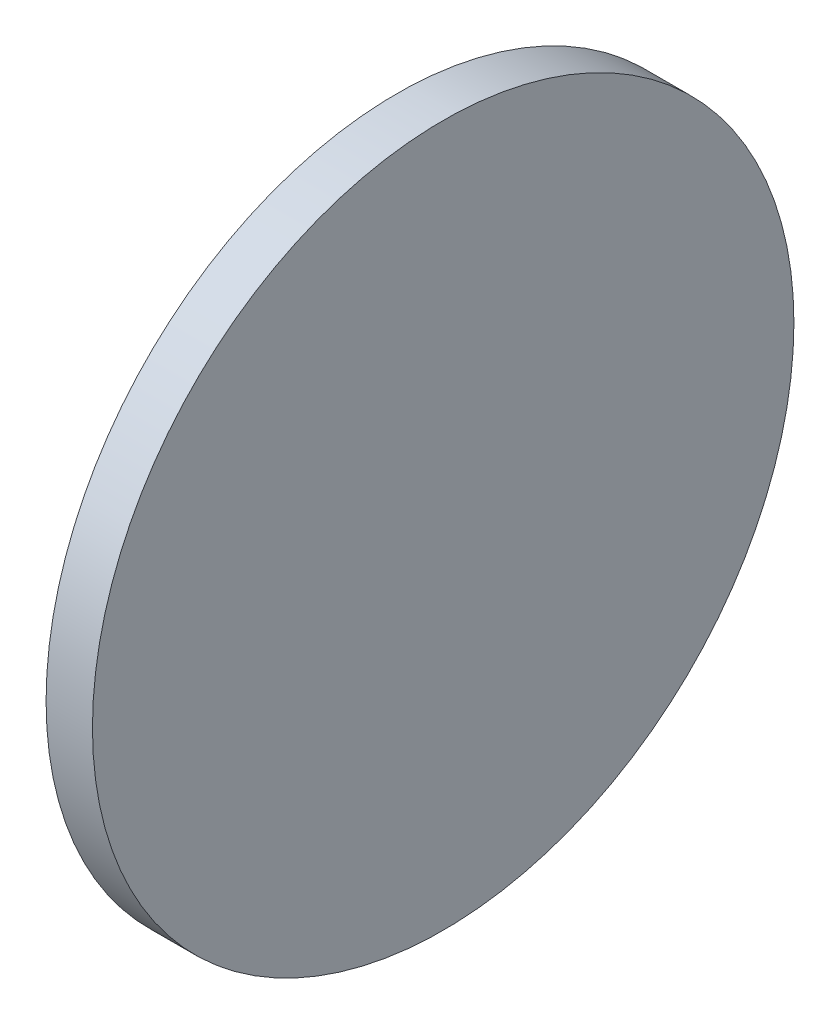
ISO-10303-21;
HEADER;
FILE_DESCRIPTION(('STEP AP214'),'2;1');
FILE_NAME('part.step','',(''),(''),'','','');
FILE_SCHEMA(('AUTOMOTIVE_DESIGN { 1 0 10303 214 1 1 1 1 }'));
ENDSEC;
DATA;
#1=APPLICATION_CONTEXT('core data for automotive mechanical design processes');
#2=APPLICATION_PROTOCOL_DEFINITION('international standard','automotive_design',2000,#1);
#3=PRODUCT_CONTEXT('',#1,'mechanical');
#4=PRODUCT('Part','Part','',(#3));
#5=PRODUCT_RELATED_PRODUCT_CATEGORY('part','',(#4));
#6=PRODUCT_DEFINITION_FORMATION('','',#4);
#7=PRODUCT_DEFINITION_CONTEXT('part definition',#1,'design');
#8=PRODUCT_DEFINITION('design','',#6,#7);
#9=PRODUCT_DEFINITION_SHAPE('','',#8);
#10=(LENGTH_UNIT() NAMED_UNIT(*) SI_UNIT(.MILLI.,.METRE.));
#11=(NAMED_UNIT(*) PLANE_ANGLE_UNIT() SI_UNIT($,.RADIAN.));
#12=(NAMED_UNIT(*) SI_UNIT($,.STERADIAN.) SOLID_ANGLE_UNIT());
#13=UNCERTAINTY_MEASURE_WITH_UNIT(LENGTH_MEASURE(1.E-05),#10,'distance_accuracy_value','');
#14=(GEOMETRIC_REPRESENTATION_CONTEXT(3) GLOBAL_UNCERTAINTY_ASSIGNED_CONTEXT((#13)) GLOBAL_UNIT_ASSIGNED_CONTEXT((#10,
#11,#12)) REPRESENTATION_CONTEXT('',''));
#15=CARTESIAN_POINT('',(0.,0.,0.));
#16=DIRECTION('',(0.,0.,1.));
#17=DIRECTION('',(1.,0.,0.));
#18=AXIS2_PLACEMENT_3D('',#15,#16,#17);
#19=CARTESIAN_POINT('',(-0.787400000000001,0.,-11.9126));
#20=DIRECTION('',(1.,0.,0.));
#21=DIRECTION('',(0.,0.,-1.));
#22=AXIS2_PLACEMENT_3D('',#19,#20,#21);
#23=PLANE('',#22);
#24=CARTESIAN_POINT('',(-0.7874,0.,0.));
#25=DIRECTION('',(-1.,0.,0.));
#26=DIRECTION('',(0.,0.,1.));
#27=AXIS2_PLACEMENT_3D('',#24,#25,#26);
#28=CIRCLE('',#27,11.9126);
#29=CARTESIAN_POINT('',(-0.7874,0.,11.9126));
#30=VERTEX_POINT('',#29);
#31=EDGE_CURVE('E44',#30,#30,#28,.T.);
#32=ORIENTED_EDGE('',*,*,#31,.T.);
#33=EDGE_LOOP('',(#32));
#34=FACE_BOUND('',#33,.T.);
#35=ADVANCED_FACE('F37',(#34),#23,.F.);
#36=CARTESIAN_POINT('',(0.7874,0.,-11.9126));
#37=DIRECTION('',(-1.,0.,0.));
#38=DIRECTION('',(0.,0.,1.));
#39=AXIS2_PLACEMENT_3D('',#36,#37,#38);
#40=PLANE('',#39);
#41=CARTESIAN_POINT('',(0.7874,0.,0.));
#42=DIRECTION('',(-1.,0.,0.));
#43=DIRECTION('',(0.,0.,1.));
#44=AXIS2_PLACEMENT_3D('',#41,#42,#43);
#45=CIRCLE('',#44,11.9126);
#46=CARTESIAN_POINT('',(0.7874,0.,11.9126));
#47=VERTEX_POINT('',#46);
#48=EDGE_CURVE('E10',#47,#47,#45,.T.);
#49=ORIENTED_EDGE('',*,*,#48,.F.);
#50=EDGE_LOOP('',(#49));
#51=FACE_BOUND('',#50,.T.);
#52=ADVANCED_FACE('F54',(#51),#40,.F.);
#53=CARTESIAN_POINT('',(-0.787400000000001,0.,0.));
#54=DIRECTION('',(-1.,0.,0.));
#55=DIRECTION('',(0.,0.,1.));
#56=AXIS2_PLACEMENT_3D('',#53,#54,#55);
#57=CYLINDRICAL_SURFACE('',#56,11.9126);
#58=ORIENTED_EDGE('',*,*,#31,.F.);
#59=EDGE_LOOP('',(#58));
#60=FACE_BOUND('',#59,.T.);
#61=ORIENTED_EDGE('',*,*,#48,.T.);
#62=EDGE_LOOP('',(#61));
#63=FACE_BOUND('',#62,.T.);
#64=ADVANCED_FACE('F52',(#60,#63),#57,.T.);
#65=CLOSED_SHELL('',(#35,#52,#64));
#66=MANIFOLD_SOLID_BREP('B2',#65);
#67=ADVANCED_BREP_SHAPE_REPRESENTATION('',(#18,#66),#14);
#68=SHAPE_DEFINITION_REPRESENTATION(#9,#67);
ENDSEC;
END-ISO-10303-21;
